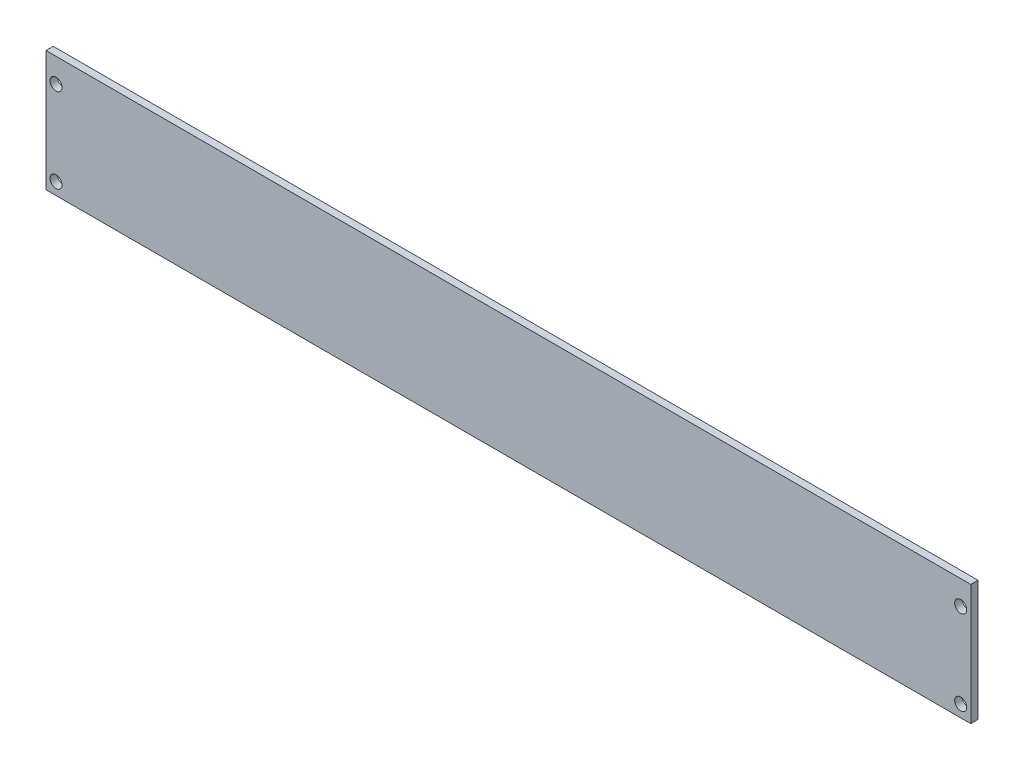
ISO-10303-21;
HEADER;
FILE_DESCRIPTION(('STEP AP214'),'2;1');
FILE_NAME('part.step','',(''),(''),'','','');
FILE_SCHEMA(('AUTOMOTIVE_DESIGN { 1 0 10303 214 1 1 1 1 }'));
ENDSEC;
DATA;
#1=APPLICATION_CONTEXT('core data for automotive mechanical design processes');
#2=APPLICATION_PROTOCOL_DEFINITION('international standard','automotive_design',2000,#1);
#3=PRODUCT_CONTEXT('',#1,'mechanical');
#4=PRODUCT('Part','Part','',(#3));
#5=PRODUCT_RELATED_PRODUCT_CATEGORY('part','',(#4));
#6=PRODUCT_DEFINITION_FORMATION('','',#4);
#7=PRODUCT_DEFINITION_CONTEXT('part definition',#1,'design');
#8=PRODUCT_DEFINITION('design','',#6,#7);
#9=PRODUCT_DEFINITION_SHAPE('','',#8);
#10=(LENGTH_UNIT() NAMED_UNIT(*) SI_UNIT(.MILLI.,.METRE.));
#11=(NAMED_UNIT(*) PLANE_ANGLE_UNIT() SI_UNIT($,.RADIAN.));
#12=(NAMED_UNIT(*) SI_UNIT($,.STERADIAN.) SOLID_ANGLE_UNIT());
#13=UNCERTAINTY_MEASURE_WITH_UNIT(LENGTH_MEASURE(1.E-05),#10,'distance_accuracy_value','');
#14=(GEOMETRIC_REPRESENTATION_CONTEXT(3) GLOBAL_UNCERTAINTY_ASSIGNED_CONTEXT((#13)) GLOBAL_UNIT_ASSIGNED_CONTEXT((#10,
#11,#12)) REPRESENTATION_CONTEXT('',''));
#15=CARTESIAN_POINT('',(0.,0.,0.));
#16=DIRECTION('',(0.,0.,1.));
#17=DIRECTION('',(1.,0.,0.));
#18=AXIS2_PLACEMENT_3D('',#15,#16,#17);
#19=CARTESIAN_POINT('',(0.,0.,2.286));
#20=DIRECTION('',(0.,0.,-1.));
#21=DIRECTION('',(-1.,0.,0.));
#22=AXIS2_PLACEMENT_3D('',#19,#20,#21);
#23=PLANE('',#22);
#24=DIRECTION('',(0.,-1.,0.));
#25=VECTOR('',#24,1.);
#26=CARTESIAN_POINT('',(-146.05,19.05,2.286));
#27=LINE('',#26,#25);
#28=CARTESIAN_POINT('',(-146.05,19.05,2.286));
#29=VERTEX_POINT('',#28);
#30=CARTESIAN_POINT('',(-146.05,-19.05,2.286));
#31=VERTEX_POINT('',#30);
#32=EDGE_CURVE('E89',#29,#31,#27,.T.);
#33=ORIENTED_EDGE('',*,*,#32,.T.);
#34=DIRECTION('',(1.,0.,0.));
#35=VECTOR('',#34,1.);
#36=CARTESIAN_POINT('',(146.05,-19.05,2.286));
#37=LINE('',#36,#35);
#38=CARTESIAN_POINT('',(146.05,-19.05,2.286));
#39=VERTEX_POINT('',#38);
#40=EDGE_CURVE('E84',#31,#39,#37,.T.);
#41=ORIENTED_EDGE('',*,*,#40,.T.);
#42=DIRECTION('',(0.,1.,0.));
#43=VECTOR('',#42,1.);
#44=CARTESIAN_POINT('',(146.05,19.05,2.286));
#45=LINE('',#44,#43);
#46=CARTESIAN_POINT('',(146.05,19.05,2.286));
#47=VERTEX_POINT('',#46);
#48=EDGE_CURVE('E87',#39,#47,#45,.T.);
#49=ORIENTED_EDGE('',*,*,#48,.T.);
#50=DIRECTION('',(-1.,0.,0.));
#51=VECTOR('',#50,1.);
#52=CARTESIAN_POINT('',(146.05,19.05,2.286));
#53=LINE('',#52,#51);
#54=EDGE_CURVE('E54',#47,#29,#53,.T.);
#55=ORIENTED_EDGE('',*,*,#54,.T.);
#56=EDGE_LOOP('',(#33,#41,#49,#55));
#57=FACE_BOUND('',#56,.T.);
#58=CARTESIAN_POINT('',(-142.875,11.43,2.286));
#59=DIRECTION('',(0.,0.,1.));
#60=DIRECTION('',(1.,0.,0.));
#61=AXIS2_PLACEMENT_3D('',#58,#59,#60);
#62=CIRCLE('',#61,1.89865000000001);
#63=CARTESIAN_POINT('',(-140.97635,11.43,2.286));
#64=VERTEX_POINT('',#63);
#65=EDGE_CURVE('E104',#64,#64,#62,.T.);
#66=ORIENTED_EDGE('',*,*,#65,.F.);
#67=EDGE_LOOP('',(#66));
#68=FACE_BOUND('',#67,.T.);
#69=CARTESIAN_POINT('',(-142.875,-15.24,2.286));
#70=DIRECTION('',(0.,0.,1.));
#71=DIRECTION('',(1.,0.,0.));
#72=AXIS2_PLACEMENT_3D('',#69,#70,#71);
#73=CIRCLE('',#72,1.89865000000001);
#74=CARTESIAN_POINT('',(-140.97635,-15.24,2.286));
#75=VERTEX_POINT('',#74);
#76=EDGE_CURVE('E119',#75,#75,#73,.T.);
#77=ORIENTED_EDGE('',*,*,#76,.F.);
#78=EDGE_LOOP('',(#77));
#79=FACE_BOUND('',#78,.T.);
#80=CARTESIAN_POINT('',(142.875,-15.24,2.286));
#81=DIRECTION('',(0.,0.,1.));
#82=DIRECTION('',(1.,0.,0.));
#83=AXIS2_PLACEMENT_3D('',#80,#81,#82);
#84=CIRCLE('',#83,1.89865000000001);
#85=CARTESIAN_POINT('',(144.77365,-15.24,2.286));
#86=VERTEX_POINT('',#85);
#87=EDGE_CURVE('E125',#86,#86,#84,.T.);
#88=ORIENTED_EDGE('',*,*,#87,.F.);
#89=EDGE_LOOP('',(#88));
#90=FACE_BOUND('',#89,.T.);
#91=CARTESIAN_POINT('',(142.875,11.43,2.286));
#92=DIRECTION('',(0.,0.,1.));
#93=DIRECTION('',(1.,0.,0.));
#94=AXIS2_PLACEMENT_3D('',#91,#92,#93);
#95=CIRCLE('',#94,1.89865000000001);
#96=CARTESIAN_POINT('',(144.77365,11.43,2.286));
#97=VERTEX_POINT('',#96);
#98=EDGE_CURVE('E131',#97,#97,#95,.T.);
#99=ORIENTED_EDGE('',*,*,#98,.F.);
#100=EDGE_LOOP('',(#99));
#101=FACE_BOUND('',#100,.T.);
#102=ADVANCED_FACE('F37',(#57,#68,#79,#90,#101),#23,.F.);
#103=CARTESIAN_POINT('',(0.,0.,0.));
#104=DIRECTION('',(0.,0.,-1.));
#105=DIRECTION('',(-1.,0.,0.));
#106=AXIS2_PLACEMENT_3D('',#103,#104,#105);
#107=PLANE('',#106);
#108=CARTESIAN_POINT('',(142.875,-15.24,0.));
#109=DIRECTION('',(0.,0.,1.));
#110=DIRECTION('',(1.,0.,0.));
#111=AXIS2_PLACEMENT_3D('',#108,#109,#110);
#112=CIRCLE('',#111,1.89865000000001);
#113=CARTESIAN_POINT('',(144.77365,-15.24,0.));
#114=VERTEX_POINT('',#113);
#115=EDGE_CURVE('E128',#114,#114,#112,.T.);
#116=ORIENTED_EDGE('',*,*,#115,.T.);
#117=EDGE_LOOP('',(#116));
#118=FACE_BOUND('',#117,.T.);
#119=CARTESIAN_POINT('',(-142.875,11.43,0.));
#120=DIRECTION('',(0.,0.,1.));
#121=DIRECTION('',(1.,0.,0.));
#122=AXIS2_PLACEMENT_3D('',#119,#120,#121);
#123=CIRCLE('',#122,1.89865000000001);
#124=CARTESIAN_POINT('',(-140.97635,11.43,0.));
#125=VERTEX_POINT('',#124);
#126=EDGE_CURVE('E116',#125,#125,#123,.T.);
#127=ORIENTED_EDGE('',*,*,#126,.T.);
#128=EDGE_LOOP('',(#127));
#129=FACE_BOUND('',#128,.T.);
#130=DIRECTION('',(0.,-1.,0.));
#131=VECTOR('',#130,1.);
#132=CARTESIAN_POINT('',(-146.05,19.05,0.));
#133=LINE('',#132,#131);
#134=CARTESIAN_POINT('',(-146.05,19.05,0.));
#135=VERTEX_POINT('',#134);
#136=CARTESIAN_POINT('',(-146.05,-19.05,0.));
#137=VERTEX_POINT('',#136);
#138=EDGE_CURVE('E101',#135,#137,#133,.T.);
#139=ORIENTED_EDGE('',*,*,#138,.F.);
#140=DIRECTION('',(-1.,0.,0.));
#141=VECTOR('',#140,1.);
#142=CARTESIAN_POINT('',(146.05,19.05,0.));
#143=LINE('',#142,#141);
#144=CARTESIAN_POINT('',(146.05,19.05,0.));
#145=VERTEX_POINT('',#144);
#146=EDGE_CURVE('E77',#145,#135,#143,.T.);
#147=ORIENTED_EDGE('',*,*,#146,.F.);
#148=DIRECTION('',(0.,1.,0.));
#149=VECTOR('',#148,1.);
#150=CARTESIAN_POINT('',(146.05,19.05,0.));
#151=LINE('',#150,#149);
#152=CARTESIAN_POINT('',(146.05,-19.05,0.));
#153=VERTEX_POINT('',#152);
#154=EDGE_CURVE('E71',#153,#145,#151,.T.);
#155=ORIENTED_EDGE('',*,*,#154,.F.);
#156=DIRECTION('',(1.,0.,0.));
#157=VECTOR('',#156,1.);
#158=CARTESIAN_POINT('',(146.05,-19.05,0.));
#159=LINE('',#158,#157);
#160=EDGE_CURVE('E93',#137,#153,#159,.T.);
#161=ORIENTED_EDGE('',*,*,#160,.F.);
#162=EDGE_LOOP('',(#139,#147,#155,#161));
#163=FACE_BOUND('',#162,.T.);
#164=CARTESIAN_POINT('',(-142.875,-15.24,0.));
#165=DIRECTION('',(0.,0.,1.));
#166=DIRECTION('',(1.,0.,0.));
#167=AXIS2_PLACEMENT_3D('',#164,#165,#166);
#168=CIRCLE('',#167,1.89865000000001);
#169=CARTESIAN_POINT('',(-140.97635,-15.24,0.));
#170=VERTEX_POINT('',#169);
#171=EDGE_CURVE('E122',#170,#170,#168,.T.);
#172=ORIENTED_EDGE('',*,*,#171,.T.);
#173=EDGE_LOOP('',(#172));
#174=FACE_BOUND('',#173,.T.);
#175=CARTESIAN_POINT('',(142.875,11.43,0.));
#176=DIRECTION('',(0.,0.,1.));
#177=DIRECTION('',(1.,0.,0.));
#178=AXIS2_PLACEMENT_3D('',#175,#176,#177);
#179=CIRCLE('',#178,1.89865000000001);
#180=CARTESIAN_POINT('',(144.77365,11.43,0.));
#181=VERTEX_POINT('',#180);
#182=EDGE_CURVE('E134',#181,#181,#179,.T.);
#183=ORIENTED_EDGE('',*,*,#182,.T.);
#184=EDGE_LOOP('',(#183));
#185=FACE_BOUND('',#184,.T.);
#186=ADVANCED_FACE('F112',(#118,#129,#163,#174,#185),#107,.T.);
#187=CARTESIAN_POINT('',(-146.05,19.05,2.286));
#188=DIRECTION('',(1.,0.,0.));
#189=DIRECTION('',(0.,0.,-1.));
#190=AXIS2_PLACEMENT_3D('',#187,#188,#189);
#191=PLANE('',#190);
#192=ORIENTED_EDGE('',*,*,#138,.T.);
#193=DIRECTION('',(0.,0.,-1.));
#194=VECTOR('',#193,1.);
#195=CARTESIAN_POINT('',(-146.05,-19.05,2.286));
#196=LINE('',#195,#194);
#197=EDGE_CURVE('E11',#31,#137,#196,.T.);
#198=ORIENTED_EDGE('',*,*,#197,.F.);
#199=ORIENTED_EDGE('',*,*,#32,.F.);
#200=DIRECTION('',(0.,0.,-1.));
#201=VECTOR('',#200,1.);
#202=CARTESIAN_POINT('',(-146.05,19.05,2.286));
#203=LINE('',#202,#201);
#204=EDGE_CURVE('E97',#29,#135,#203,.T.);
#205=ORIENTED_EDGE('',*,*,#204,.T.);
#206=EDGE_LOOP('',(#192,#198,#199,#205));
#207=FACE_BOUND('',#206,.T.);
#208=ADVANCED_FACE('F39',(#207),#191,.F.);
#209=CARTESIAN_POINT('',(146.05,-19.05,2.286));
#210=DIRECTION('',(0.,1.,0.));
#211=DIRECTION('',(-1.,0.,0.));
#212=AXIS2_PLACEMENT_3D('',#209,#210,#211);
#213=PLANE('',#212);
#214=ORIENTED_EDGE('',*,*,#160,.T.);
#215=DIRECTION('',(0.,0.,-1.));
#216=VECTOR('',#215,1.);
#217=CARTESIAN_POINT('',(146.05,-19.05,2.286));
#218=LINE('',#217,#216);
#219=EDGE_CURVE('E46',#39,#153,#218,.T.);
#220=ORIENTED_EDGE('',*,*,#219,.F.);
#221=ORIENTED_EDGE('',*,*,#40,.F.);
#222=ORIENTED_EDGE('',*,*,#197,.T.);
#223=EDGE_LOOP('',(#214,#220,#221,#222));
#224=FACE_BOUND('',#223,.T.);
#225=ADVANCED_FACE('F92',(#224),#213,.F.);
#226=CARTESIAN_POINT('',(146.05,19.05,2.286));
#227=DIRECTION('',(-1.,0.,0.));
#228=DIRECTION('',(0.,0.,1.));
#229=AXIS2_PLACEMENT_3D('',#226,#227,#228);
#230=PLANE('',#229);
#231=ORIENTED_EDGE('',*,*,#154,.T.);
#232=DIRECTION('',(0.,0.,-1.));
#233=VECTOR('',#232,1.);
#234=CARTESIAN_POINT('',(146.05,19.05,2.286));
#235=LINE('',#234,#233);
#236=EDGE_CURVE('E94',#47,#145,#235,.T.);
#237=ORIENTED_EDGE('',*,*,#236,.F.);
#238=ORIENTED_EDGE('',*,*,#48,.F.);
#239=ORIENTED_EDGE('',*,*,#219,.T.);
#240=EDGE_LOOP('',(#231,#237,#238,#239));
#241=FACE_BOUND('',#240,.T.);
#242=ADVANCED_FACE('F95',(#241),#230,.F.);
#243=CARTESIAN_POINT('',(146.05,19.05,2.286));
#244=DIRECTION('',(0.,-1.,0.));
#245=DIRECTION('',(1.,0.,0.));
#246=AXIS2_PLACEMENT_3D('',#243,#244,#245);
#247=PLANE('',#246);
#248=ORIENTED_EDGE('',*,*,#146,.T.);
#249=ORIENTED_EDGE('',*,*,#204,.F.);
#250=ORIENTED_EDGE('',*,*,#54,.F.);
#251=ORIENTED_EDGE('',*,*,#236,.T.);
#252=EDGE_LOOP('',(#248,#249,#250,#251));
#253=FACE_BOUND('',#252,.T.);
#254=ADVANCED_FACE('F109',(#253),#247,.F.);
#255=CARTESIAN_POINT('',(-142.875,11.43,2.286));
#256=DIRECTION('',(0.,0.,-1.));
#257=DIRECTION('',(-1.,0.,0.));
#258=AXIS2_PLACEMENT_3D('',#255,#256,#257);
#259=CYLINDRICAL_SURFACE('',#258,1.89865000000001);
#260=ORIENTED_EDGE('',*,*,#65,.T.);
#261=EDGE_LOOP('',(#260));
#262=FACE_BOUND('',#261,.T.);
#263=ORIENTED_EDGE('',*,*,#126,.F.);
#264=EDGE_LOOP('',(#263));
#265=FACE_BOUND('',#264,.T.);
#266=ADVANCED_FACE('F151',(#262,#265),#259,.F.);
#267=CARTESIAN_POINT('',(-142.875,-15.24,2.286));
#268=DIRECTION('',(0.,0.,-1.));
#269=DIRECTION('',(-1.,0.,0.));
#270=AXIS2_PLACEMENT_3D('',#267,#268,#269);
#271=CYLINDRICAL_SURFACE('',#270,1.89865000000001);
#272=ORIENTED_EDGE('',*,*,#76,.T.);
#273=EDGE_LOOP('',(#272));
#274=FACE_BOUND('',#273,.T.);
#275=ORIENTED_EDGE('',*,*,#171,.F.);
#276=EDGE_LOOP('',(#275));
#277=FACE_BOUND('',#276,.T.);
#278=ADVANCED_FACE('F205',(#274,#277),#271,.F.);
#279=CARTESIAN_POINT('',(142.875,-15.24,2.286));
#280=DIRECTION('',(0.,0.,-1.));
#281=DIRECTION('',(-1.,0.,0.));
#282=AXIS2_PLACEMENT_3D('',#279,#280,#281);
#283=CYLINDRICAL_SURFACE('',#282,1.89865000000001);
#284=ORIENTED_EDGE('',*,*,#87,.T.);
#285=EDGE_LOOP('',(#284));
#286=FACE_BOUND('',#285,.T.);
#287=ORIENTED_EDGE('',*,*,#115,.F.);
#288=EDGE_LOOP('',(#287));
#289=FACE_BOUND('',#288,.T.);
#290=ADVANCED_FACE('F214',(#286,#289),#283,.F.);
#291=CARTESIAN_POINT('',(142.875,11.43,2.286));
#292=DIRECTION('',(0.,0.,-1.));
#293=DIRECTION('',(-1.,0.,0.));
#294=AXIS2_PLACEMENT_3D('',#291,#292,#293);
#295=CYLINDRICAL_SURFACE('',#294,1.89865000000001);
#296=ORIENTED_EDGE('',*,*,#98,.T.);
#297=EDGE_LOOP('',(#296));
#298=FACE_BOUND('',#297,.T.);
#299=ORIENTED_EDGE('',*,*,#182,.F.);
#300=EDGE_LOOP('',(#299));
#301=FACE_BOUND('',#300,.T.);
#302=ADVANCED_FACE('F140',(#298,#301),#295,.F.);
#303=CLOSED_SHELL('',(#102,#186,#208,#225,#242,#254,#266,#278,#290,#302));
#304=MANIFOLD_SOLID_BREP('B2',#303);
#305=ADVANCED_BREP_SHAPE_REPRESENTATION('',(#18,#304),#14);
#306=SHAPE_DEFINITION_REPRESENTATION(#9,#305);
ENDSEC;
END-ISO-10303-21;
